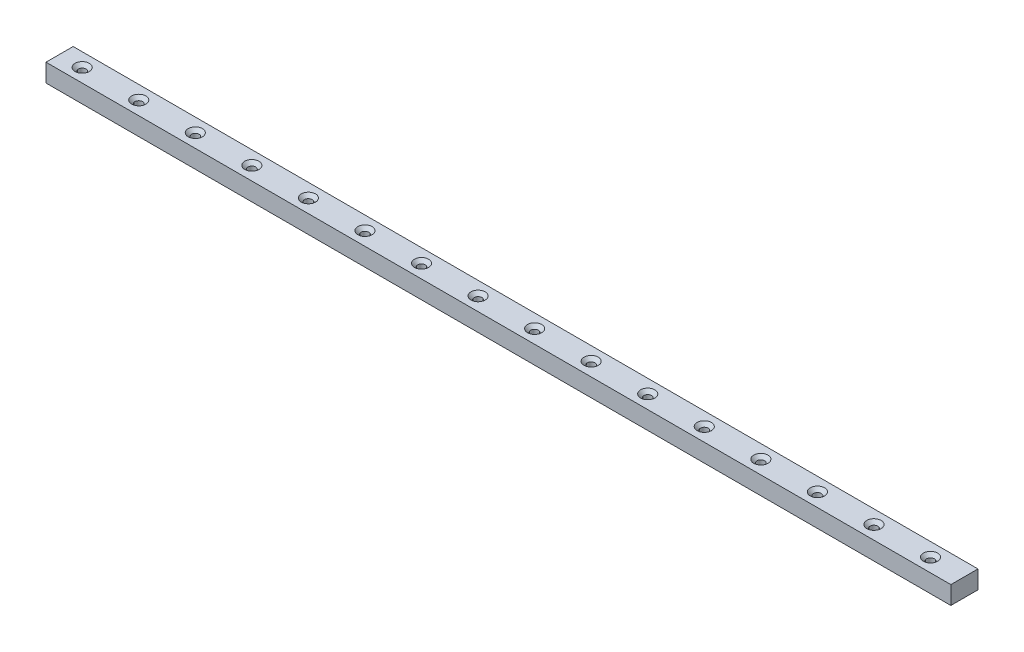
ISO-10303-21;
HEADER;
FILE_DESCRIPTION(('STEP AP214'),'2;1');
FILE_NAME('part.step','',(''),(''),'','','');
FILE_SCHEMA(('AUTOMOTIVE_DESIGN { 1 0 10303 214 1 1 1 1 }'));
ENDSEC;
DATA;
#1=APPLICATION_CONTEXT('core data for automotive mechanical design processes');
#2=APPLICATION_PROTOCOL_DEFINITION('international standard','automotive_design',2000,#1);
#3=PRODUCT_CONTEXT('',#1,'mechanical');
#4=PRODUCT('Part','Part','',(#3));
#5=PRODUCT_RELATED_PRODUCT_CATEGORY('part','',(#4));
#6=PRODUCT_DEFINITION_FORMATION('','',#4);
#7=PRODUCT_DEFINITION_CONTEXT('part definition',#1,'design');
#8=PRODUCT_DEFINITION('design','',#6,#7);
#9=PRODUCT_DEFINITION_SHAPE('','',#8);
#10=(LENGTH_UNIT() NAMED_UNIT(*) SI_UNIT(.MILLI.,.METRE.));
#11=(NAMED_UNIT(*) PLANE_ANGLE_UNIT() SI_UNIT($,.RADIAN.));
#12=(NAMED_UNIT(*) SI_UNIT($,.STERADIAN.) SOLID_ANGLE_UNIT());
#13=UNCERTAINTY_MEASURE_WITH_UNIT(LENGTH_MEASURE(1.E-05),#10,'distance_accuracy_value','');
#14=(GEOMETRIC_REPRESENTATION_CONTEXT(3) GLOBAL_UNCERTAINTY_ASSIGNED_CONTEXT((#13)) GLOBAL_UNIT_ASSIGNED_CONTEXT((#10,
#11,#12)) REPRESENTATION_CONTEXT('',''));
#15=CARTESIAN_POINT('',(0.,0.,0.));
#16=DIRECTION('',(0.,0.,1.));
#17=DIRECTION('',(1.,0.,0.));
#18=AXIS2_PLACEMENT_3D('',#15,#16,#17);
#19=CARTESIAN_POINT('',(385.,4.,0.));
#20=DIRECTION('',(0.,1.,0.));
#21=DIRECTION('',(0.,0.,1.));
#22=AXIS2_PLACEMENT_3D('',#19,#20,#21);
#23=CONICAL_SURFACE('',#22,3.15,0.785398163397448);
#24=CARTESIAN_POINT('',(385.,2.55,0.));
#25=DIRECTION('',(0.,1.,0.));
#26=DIRECTION('',(0.,0.,1.));
#27=AXIS2_PLACEMENT_3D('',#24,#25,#26);
#28=CIRCLE('',#27,1.7);
#29=CARTESIAN_POINT('',(385.,2.55,1.7));
#30=VERTEX_POINT('',#29);
#31=EDGE_CURVE('E11',#30,#30,#28,.T.);
#32=ORIENTED_EDGE('',*,*,#31,.F.);
#33=EDGE_LOOP('',(#32));
#34=FACE_BOUND('',#33,.T.);
#35=CARTESIAN_POINT('',(385.,4.,0.));
#36=DIRECTION('',(0.,1.,0.));
#37=DIRECTION('',(0.,0.,1.));
#38=AXIS2_PLACEMENT_3D('',#35,#36,#37);
#39=CIRCLE('',#38,3.15);
#40=CARTESIAN_POINT('',(385.,4.,3.15));
#41=VERTEX_POINT('',#40);
#42=EDGE_CURVE('E295',#41,#41,#39,.T.);
#43=ORIENTED_EDGE('',*,*,#42,.T.);
#44=EDGE_LOOP('',(#43));
#45=FACE_BOUND('',#44,.T.);
#46=ADVANCED_FACE('F45',(#34,#45),#23,.F.);
#47=CARTESIAN_POINT('',(385.,4.,0.));
#48=DIRECTION('',(0.,1.,0.));
#49=DIRECTION('',(0.,0.,1.));
#50=AXIS2_PLACEMENT_3D('',#47,#48,#49);
#51=CYLINDRICAL_SURFACE('',#50,1.7);
#52=CARTESIAN_POINT('',(385.,-4.,0.));
#53=DIRECTION('',(0.,1.,0.));
#54=DIRECTION('',(0.,0.,1.));
#55=AXIS2_PLACEMENT_3D('',#52,#53,#54);
#56=CIRCLE('',#55,1.7);
#57=CARTESIAN_POINT('',(385.,-4.,1.7));
#58=VERTEX_POINT('',#57);
#59=EDGE_CURVE('E54',#58,#58,#56,.T.);
#60=ORIENTED_EDGE('',*,*,#59,.F.);
#61=EDGE_LOOP('',(#60));
#62=FACE_BOUND('',#61,.T.);
#63=ORIENTED_EDGE('',*,*,#31,.T.);
#64=EDGE_LOOP('',(#63));
#65=FACE_BOUND('',#64,.T.);
#66=ADVANCED_FACE('F304',(#62,#65),#51,.F.);
#67=CARTESIAN_POINT('',(360.,4.,0.));
#68=DIRECTION('',(0.,1.,0.));
#69=DIRECTION('',(0.,0.,1.));
#70=AXIS2_PLACEMENT_3D('',#67,#68,#69);
#71=CONICAL_SURFACE('',#70,3.15,0.785398163397448);
#72=CARTESIAN_POINT('',(360.,2.55,0.));
#73=DIRECTION('',(0.,1.,0.));
#74=DIRECTION('',(0.,0.,1.));
#75=AXIS2_PLACEMENT_3D('',#72,#73,#74);
#76=CIRCLE('',#75,1.7);
#77=CARTESIAN_POINT('',(360.,2.55,1.7));
#78=VERTEX_POINT('',#77);
#79=EDGE_CURVE('E291',#78,#78,#76,.T.);
#80=ORIENTED_EDGE('',*,*,#79,.F.);
#81=EDGE_LOOP('',(#80));
#82=FACE_BOUND('',#81,.T.);
#83=CARTESIAN_POINT('',(360.,4.,0.));
#84=DIRECTION('',(0.,1.,0.));
#85=DIRECTION('',(0.,0.,1.));
#86=AXIS2_PLACEMENT_3D('',#83,#84,#85);
#87=CIRCLE('',#86,3.15);
#88=CARTESIAN_POINT('',(360.,4.,3.15));
#89=VERTEX_POINT('',#88);
#90=EDGE_CURVE('E283',#89,#89,#87,.T.);
#91=ORIENTED_EDGE('',*,*,#90,.T.);
#92=EDGE_LOOP('',(#91));
#93=FACE_BOUND('',#92,.T.);
#94=ADVANCED_FACE('F307',(#82,#93),#71,.F.);
#95=CARTESIAN_POINT('',(360.,4.,0.));
#96=DIRECTION('',(0.,1.,0.));
#97=DIRECTION('',(0.,0.,1.));
#98=AXIS2_PLACEMENT_3D('',#95,#96,#97);
#99=CYLINDRICAL_SURFACE('',#98,1.7);
#100=CARTESIAN_POINT('',(360.,-4.,0.));
#101=DIRECTION('',(0.,1.,0.));
#102=DIRECTION('',(0.,0.,1.));
#103=AXIS2_PLACEMENT_3D('',#100,#101,#102);
#104=CIRCLE('',#103,1.7);
#105=CARTESIAN_POINT('',(360.,-4.,1.7));
#106=VERTEX_POINT('',#105);
#107=EDGE_CURVE('E287',#106,#106,#104,.T.);
#108=ORIENTED_EDGE('',*,*,#107,.F.);
#109=EDGE_LOOP('',(#108));
#110=FACE_BOUND('',#109,.T.);
#111=ORIENTED_EDGE('',*,*,#79,.T.);
#112=EDGE_LOOP('',(#111));
#113=FACE_BOUND('',#112,.T.);
#114=ADVANCED_FACE('F428',(#110,#113),#99,.F.);
#115=CARTESIAN_POINT('',(335.,4.,0.));
#116=DIRECTION('',(0.,1.,0.));
#117=DIRECTION('',(0.,0.,1.));
#118=AXIS2_PLACEMENT_3D('',#115,#116,#117);
#119=CONICAL_SURFACE('',#118,3.15,0.785398163397448);
#120=CARTESIAN_POINT('',(335.,2.55,0.));
#121=DIRECTION('',(0.,1.,0.));
#122=DIRECTION('',(0.,0.,1.));
#123=AXIS2_PLACEMENT_3D('',#120,#121,#122);
#124=CIRCLE('',#123,1.7);
#125=CARTESIAN_POINT('',(335.,2.55,1.7));
#126=VERTEX_POINT('',#125);
#127=EDGE_CURVE('E279',#126,#126,#124,.T.);
#128=ORIENTED_EDGE('',*,*,#127,.F.);
#129=EDGE_LOOP('',(#128));
#130=FACE_BOUND('',#129,.T.);
#131=CARTESIAN_POINT('',(335.,4.,0.));
#132=DIRECTION('',(0.,1.,0.));
#133=DIRECTION('',(0.,0.,1.));
#134=AXIS2_PLACEMENT_3D('',#131,#132,#133);
#135=CIRCLE('',#134,3.15);
#136=CARTESIAN_POINT('',(335.,4.,3.15));
#137=VERTEX_POINT('',#136);
#138=EDGE_CURVE('E271',#137,#137,#135,.T.);
#139=ORIENTED_EDGE('',*,*,#138,.T.);
#140=EDGE_LOOP('',(#139));
#141=FACE_BOUND('',#140,.T.);
#142=ADVANCED_FACE('F424',(#130,#141),#119,.F.);
#143=CARTESIAN_POINT('',(335.,4.,0.));
#144=DIRECTION('',(0.,1.,0.));
#145=DIRECTION('',(0.,0.,1.));
#146=AXIS2_PLACEMENT_3D('',#143,#144,#145);
#147=CYLINDRICAL_SURFACE('',#146,1.7);
#148=CARTESIAN_POINT('',(335.,-4.,0.));
#149=DIRECTION('',(0.,1.,0.));
#150=DIRECTION('',(0.,0.,1.));
#151=AXIS2_PLACEMENT_3D('',#148,#149,#150);
#152=CIRCLE('',#151,1.7);
#153=CARTESIAN_POINT('',(335.,-4.,1.7));
#154=VERTEX_POINT('',#153);
#155=EDGE_CURVE('E275',#154,#154,#152,.T.);
#156=ORIENTED_EDGE('',*,*,#155,.F.);
#157=EDGE_LOOP('',(#156));
#158=FACE_BOUND('',#157,.T.);
#159=ORIENTED_EDGE('',*,*,#127,.T.);
#160=EDGE_LOOP('',(#159));
#161=FACE_BOUND('',#160,.T.);
#162=ADVANCED_FACE('F420',(#158,#161),#147,.F.);
#163=CARTESIAN_POINT('',(310.,4.,0.));
#164=DIRECTION('',(0.,1.,0.));
#165=DIRECTION('',(0.,0.,1.));
#166=AXIS2_PLACEMENT_3D('',#163,#164,#165);
#167=CONICAL_SURFACE('',#166,3.15,0.785398163397448);
#168=CARTESIAN_POINT('',(310.,2.55,0.));
#169=DIRECTION('',(0.,1.,0.));
#170=DIRECTION('',(0.,0.,1.));
#171=AXIS2_PLACEMENT_3D('',#168,#169,#170);
#172=CIRCLE('',#171,1.7);
#173=CARTESIAN_POINT('',(310.,2.55,1.7));
#174=VERTEX_POINT('',#173);
#175=EDGE_CURVE('E267',#174,#174,#172,.T.);
#176=ORIENTED_EDGE('',*,*,#175,.F.);
#177=EDGE_LOOP('',(#176));
#178=FACE_BOUND('',#177,.T.);
#179=CARTESIAN_POINT('',(310.,4.,0.));
#180=DIRECTION('',(0.,1.,0.));
#181=DIRECTION('',(0.,0.,1.));
#182=AXIS2_PLACEMENT_3D('',#179,#180,#181);
#183=CIRCLE('',#182,3.15);
#184=CARTESIAN_POINT('',(310.,4.,3.15));
#185=VERTEX_POINT('',#184);
#186=EDGE_CURVE('E259',#185,#185,#183,.T.);
#187=ORIENTED_EDGE('',*,*,#186,.T.);
#188=EDGE_LOOP('',(#187));
#189=FACE_BOUND('',#188,.T.);
#190=ADVANCED_FACE('F416',(#178,#189),#167,.F.);
#191=CARTESIAN_POINT('',(310.,4.,0.));
#192=DIRECTION('',(0.,1.,0.));
#193=DIRECTION('',(0.,0.,1.));
#194=AXIS2_PLACEMENT_3D('',#191,#192,#193);
#195=CYLINDRICAL_SURFACE('',#194,1.7);
#196=CARTESIAN_POINT('',(310.,-4.,0.));
#197=DIRECTION('',(0.,1.,0.));
#198=DIRECTION('',(0.,0.,1.));
#199=AXIS2_PLACEMENT_3D('',#196,#197,#198);
#200=CIRCLE('',#199,1.7);
#201=CARTESIAN_POINT('',(310.,-4.,1.7));
#202=VERTEX_POINT('',#201);
#203=EDGE_CURVE('E263',#202,#202,#200,.T.);
#204=ORIENTED_EDGE('',*,*,#203,.F.);
#205=EDGE_LOOP('',(#204));
#206=FACE_BOUND('',#205,.T.);
#207=ORIENTED_EDGE('',*,*,#175,.T.);
#208=EDGE_LOOP('',(#207));
#209=FACE_BOUND('',#208,.T.);
#210=ADVANCED_FACE('F412',(#206,#209),#195,.F.);
#211=CARTESIAN_POINT('',(285.,4.,0.));
#212=DIRECTION('',(0.,1.,0.));
#213=DIRECTION('',(0.,0.,1.));
#214=AXIS2_PLACEMENT_3D('',#211,#212,#213);
#215=CONICAL_SURFACE('',#214,3.15,0.785398163397448);
#216=CARTESIAN_POINT('',(285.,2.55,0.));
#217=DIRECTION('',(0.,1.,0.));
#218=DIRECTION('',(0.,0.,1.));
#219=AXIS2_PLACEMENT_3D('',#216,#217,#218);
#220=CIRCLE('',#219,1.7);
#221=CARTESIAN_POINT('',(285.,2.55,1.7));
#222=VERTEX_POINT('',#221);
#223=EDGE_CURVE('E255',#222,#222,#220,.T.);
#224=ORIENTED_EDGE('',*,*,#223,.F.);
#225=EDGE_LOOP('',(#224));
#226=FACE_BOUND('',#225,.T.);
#227=CARTESIAN_POINT('',(285.,4.,0.));
#228=DIRECTION('',(0.,1.,0.));
#229=DIRECTION('',(0.,0.,1.));
#230=AXIS2_PLACEMENT_3D('',#227,#228,#229);
#231=CIRCLE('',#230,3.15);
#232=CARTESIAN_POINT('',(285.,4.,3.15));
#233=VERTEX_POINT('',#232);
#234=EDGE_CURVE('E247',#233,#233,#231,.T.);
#235=ORIENTED_EDGE('',*,*,#234,.T.);
#236=EDGE_LOOP('',(#235));
#237=FACE_BOUND('',#236,.T.);
#238=ADVANCED_FACE('F408',(#226,#237),#215,.F.);
#239=CARTESIAN_POINT('',(285.,4.,0.));
#240=DIRECTION('',(0.,1.,0.));
#241=DIRECTION('',(0.,0.,1.));
#242=AXIS2_PLACEMENT_3D('',#239,#240,#241);
#243=CYLINDRICAL_SURFACE('',#242,1.7);
#244=CARTESIAN_POINT('',(285.,-4.,0.));
#245=DIRECTION('',(0.,1.,0.));
#246=DIRECTION('',(0.,0.,1.));
#247=AXIS2_PLACEMENT_3D('',#244,#245,#246);
#248=CIRCLE('',#247,1.7);
#249=CARTESIAN_POINT('',(285.,-4.,1.7));
#250=VERTEX_POINT('',#249);
#251=EDGE_CURVE('E251',#250,#250,#248,.T.);
#252=ORIENTED_EDGE('',*,*,#251,.F.);
#253=EDGE_LOOP('',(#252));
#254=FACE_BOUND('',#253,.T.);
#255=ORIENTED_EDGE('',*,*,#223,.T.);
#256=EDGE_LOOP('',(#255));
#257=FACE_BOUND('',#256,.T.);
#258=ADVANCED_FACE('F404',(#254,#257),#243,.F.);
#259=CARTESIAN_POINT('',(260.,4.,0.));
#260=DIRECTION('',(0.,1.,0.));
#261=DIRECTION('',(0.,0.,1.));
#262=AXIS2_PLACEMENT_3D('',#259,#260,#261);
#263=CONICAL_SURFACE('',#262,3.15,0.785398163397448);
#264=CARTESIAN_POINT('',(260.,2.55,0.));
#265=DIRECTION('',(0.,1.,0.));
#266=DIRECTION('',(0.,0.,1.));
#267=AXIS2_PLACEMENT_3D('',#264,#265,#266);
#268=CIRCLE('',#267,1.7);
#269=CARTESIAN_POINT('',(260.,2.55,1.7));
#270=VERTEX_POINT('',#269);
#271=EDGE_CURVE('E243',#270,#270,#268,.T.);
#272=ORIENTED_EDGE('',*,*,#271,.F.);
#273=EDGE_LOOP('',(#272));
#274=FACE_BOUND('',#273,.T.);
#275=CARTESIAN_POINT('',(260.,4.,0.));
#276=DIRECTION('',(0.,1.,0.));
#277=DIRECTION('',(0.,0.,1.));
#278=AXIS2_PLACEMENT_3D('',#275,#276,#277);
#279=CIRCLE('',#278,3.15);
#280=CARTESIAN_POINT('',(260.,4.,3.15));
#281=VERTEX_POINT('',#280);
#282=EDGE_CURVE('E235',#281,#281,#279,.T.);
#283=ORIENTED_EDGE('',*,*,#282,.T.);
#284=EDGE_LOOP('',(#283));
#285=FACE_BOUND('',#284,.T.);
#286=ADVANCED_FACE('F400',(#274,#285),#263,.F.);
#287=CARTESIAN_POINT('',(260.,4.,0.));
#288=DIRECTION('',(0.,1.,0.));
#289=DIRECTION('',(0.,0.,1.));
#290=AXIS2_PLACEMENT_3D('',#287,#288,#289);
#291=CYLINDRICAL_SURFACE('',#290,1.7);
#292=CARTESIAN_POINT('',(260.,-4.,0.));
#293=DIRECTION('',(0.,1.,0.));
#294=DIRECTION('',(0.,0.,1.));
#295=AXIS2_PLACEMENT_3D('',#292,#293,#294);
#296=CIRCLE('',#295,1.7);
#297=CARTESIAN_POINT('',(260.,-4.,1.7));
#298=VERTEX_POINT('',#297);
#299=EDGE_CURVE('E239',#298,#298,#296,.T.);
#300=ORIENTED_EDGE('',*,*,#299,.F.);
#301=EDGE_LOOP('',(#300));
#302=FACE_BOUND('',#301,.T.);
#303=ORIENTED_EDGE('',*,*,#271,.T.);
#304=EDGE_LOOP('',(#303));
#305=FACE_BOUND('',#304,.T.);
#306=ADVANCED_FACE('F396',(#302,#305),#291,.F.);
#307=CARTESIAN_POINT('',(235.,4.,0.));
#308=DIRECTION('',(0.,1.,0.));
#309=DIRECTION('',(0.,0.,1.));
#310=AXIS2_PLACEMENT_3D('',#307,#308,#309);
#311=CONICAL_SURFACE('',#310,3.15,0.785398163397448);
#312=CARTESIAN_POINT('',(235.,2.55,0.));
#313=DIRECTION('',(0.,1.,0.));
#314=DIRECTION('',(0.,0.,1.));
#315=AXIS2_PLACEMENT_3D('',#312,#313,#314);
#316=CIRCLE('',#315,1.7);
#317=CARTESIAN_POINT('',(235.,2.55,1.7));
#318=VERTEX_POINT('',#317);
#319=EDGE_CURVE('E231',#318,#318,#316,.T.);
#320=ORIENTED_EDGE('',*,*,#319,.F.);
#321=EDGE_LOOP('',(#320));
#322=FACE_BOUND('',#321,.T.);
#323=CARTESIAN_POINT('',(235.,4.,0.));
#324=DIRECTION('',(0.,1.,0.));
#325=DIRECTION('',(0.,0.,1.));
#326=AXIS2_PLACEMENT_3D('',#323,#324,#325);
#327=CIRCLE('',#326,3.15);
#328=CARTESIAN_POINT('',(235.,4.,3.15));
#329=VERTEX_POINT('',#328);
#330=EDGE_CURVE('E223',#329,#329,#327,.T.);
#331=ORIENTED_EDGE('',*,*,#330,.T.);
#332=EDGE_LOOP('',(#331));
#333=FACE_BOUND('',#332,.T.);
#334=ADVANCED_FACE('F392',(#322,#333),#311,.F.);
#335=CARTESIAN_POINT('',(235.,4.,0.));
#336=DIRECTION('',(0.,1.,0.));
#337=DIRECTION('',(0.,0.,1.));
#338=AXIS2_PLACEMENT_3D('',#335,#336,#337);
#339=CYLINDRICAL_SURFACE('',#338,1.7);
#340=CARTESIAN_POINT('',(235.,-4.,0.));
#341=DIRECTION('',(0.,1.,0.));
#342=DIRECTION('',(0.,0.,1.));
#343=AXIS2_PLACEMENT_3D('',#340,#341,#342);
#344=CIRCLE('',#343,1.7);
#345=CARTESIAN_POINT('',(235.,-4.,1.7));
#346=VERTEX_POINT('',#345);
#347=EDGE_CURVE('E227',#346,#346,#344,.T.);
#348=ORIENTED_EDGE('',*,*,#347,.F.);
#349=EDGE_LOOP('',(#348));
#350=FACE_BOUND('',#349,.T.);
#351=ORIENTED_EDGE('',*,*,#319,.T.);
#352=EDGE_LOOP('',(#351));
#353=FACE_BOUND('',#352,.T.);
#354=ADVANCED_FACE('F388',(#350,#353),#339,.F.);
#355=CARTESIAN_POINT('',(210.,4.,0.));
#356=DIRECTION('',(0.,1.,0.));
#357=DIRECTION('',(0.,0.,1.));
#358=AXIS2_PLACEMENT_3D('',#355,#356,#357);
#359=CONICAL_SURFACE('',#358,3.15,0.785398163397448);
#360=CARTESIAN_POINT('',(210.,2.55,0.));
#361=DIRECTION('',(0.,1.,0.));
#362=DIRECTION('',(0.,0.,1.));
#363=AXIS2_PLACEMENT_3D('',#360,#361,#362);
#364=CIRCLE('',#363,1.7);
#365=CARTESIAN_POINT('',(210.,2.55,1.7));
#366=VERTEX_POINT('',#365);
#367=EDGE_CURVE('E219',#366,#366,#364,.T.);
#368=ORIENTED_EDGE('',*,*,#367,.F.);
#369=EDGE_LOOP('',(#368));
#370=FACE_BOUND('',#369,.T.);
#371=CARTESIAN_POINT('',(210.,4.,0.));
#372=DIRECTION('',(0.,1.,0.));
#373=DIRECTION('',(0.,0.,1.));
#374=AXIS2_PLACEMENT_3D('',#371,#372,#373);
#375=CIRCLE('',#374,3.15);
#376=CARTESIAN_POINT('',(210.,4.,3.15));
#377=VERTEX_POINT('',#376);
#378=EDGE_CURVE('E211',#377,#377,#375,.T.);
#379=ORIENTED_EDGE('',*,*,#378,.T.);
#380=EDGE_LOOP('',(#379));
#381=FACE_BOUND('',#380,.T.);
#382=ADVANCED_FACE('F384',(#370,#381),#359,.F.);
#383=CARTESIAN_POINT('',(210.,4.,0.));
#384=DIRECTION('',(0.,1.,0.));
#385=DIRECTION('',(0.,0.,1.));
#386=AXIS2_PLACEMENT_3D('',#383,#384,#385);
#387=CYLINDRICAL_SURFACE('',#386,1.7);
#388=CARTESIAN_POINT('',(210.,-4.,0.));
#389=DIRECTION('',(0.,1.,0.));
#390=DIRECTION('',(0.,0.,1.));
#391=AXIS2_PLACEMENT_3D('',#388,#389,#390);
#392=CIRCLE('',#391,1.7);
#393=CARTESIAN_POINT('',(210.,-4.,1.7));
#394=VERTEX_POINT('',#393);
#395=EDGE_CURVE('E215',#394,#394,#392,.T.);
#396=ORIENTED_EDGE('',*,*,#395,.F.);
#397=EDGE_LOOP('',(#396));
#398=FACE_BOUND('',#397,.T.);
#399=ORIENTED_EDGE('',*,*,#367,.T.);
#400=EDGE_LOOP('',(#399));
#401=FACE_BOUND('',#400,.T.);
#402=ADVANCED_FACE('F380',(#398,#401),#387,.F.);
#403=CARTESIAN_POINT('',(185.,4.,0.));
#404=DIRECTION('',(0.,1.,0.));
#405=DIRECTION('',(0.,0.,1.));
#406=AXIS2_PLACEMENT_3D('',#403,#404,#405);
#407=CONICAL_SURFACE('',#406,3.15,0.785398163397448);
#408=CARTESIAN_POINT('',(185.,2.55,0.));
#409=DIRECTION('',(0.,1.,0.));
#410=DIRECTION('',(0.,0.,1.));
#411=AXIS2_PLACEMENT_3D('',#408,#409,#410);
#412=CIRCLE('',#411,1.7);
#413=CARTESIAN_POINT('',(185.,2.55,1.7));
#414=VERTEX_POINT('',#413);
#415=EDGE_CURVE('E207',#414,#414,#412,.T.);
#416=ORIENTED_EDGE('',*,*,#415,.F.);
#417=EDGE_LOOP('',(#416));
#418=FACE_BOUND('',#417,.T.);
#419=CARTESIAN_POINT('',(185.,4.,0.));
#420=DIRECTION('',(0.,1.,0.));
#421=DIRECTION('',(0.,0.,1.));
#422=AXIS2_PLACEMENT_3D('',#419,#420,#421);
#423=CIRCLE('',#422,3.15);
#424=CARTESIAN_POINT('',(185.,4.,3.15));
#425=VERTEX_POINT('',#424);
#426=EDGE_CURVE('E199',#425,#425,#423,.T.);
#427=ORIENTED_EDGE('',*,*,#426,.T.);
#428=EDGE_LOOP('',(#427));
#429=FACE_BOUND('',#428,.T.);
#430=ADVANCED_FACE('F376',(#418,#429),#407,.F.);
#431=CARTESIAN_POINT('',(185.,4.,0.));
#432=DIRECTION('',(0.,1.,0.));
#433=DIRECTION('',(0.,0.,1.));
#434=AXIS2_PLACEMENT_3D('',#431,#432,#433);
#435=CYLINDRICAL_SURFACE('',#434,1.7);
#436=CARTESIAN_POINT('',(185.,-4.,0.));
#437=DIRECTION('',(0.,1.,0.));
#438=DIRECTION('',(0.,0.,1.));
#439=AXIS2_PLACEMENT_3D('',#436,#437,#438);
#440=CIRCLE('',#439,1.7);
#441=CARTESIAN_POINT('',(185.,-4.,1.7));
#442=VERTEX_POINT('',#441);
#443=EDGE_CURVE('E203',#442,#442,#440,.T.);
#444=ORIENTED_EDGE('',*,*,#443,.F.);
#445=EDGE_LOOP('',(#444));
#446=FACE_BOUND('',#445,.T.);
#447=ORIENTED_EDGE('',*,*,#415,.T.);
#448=EDGE_LOOP('',(#447));
#449=FACE_BOUND('',#448,.T.);
#450=ADVANCED_FACE('F372',(#446,#449),#435,.F.);
#451=CARTESIAN_POINT('',(160.,4.,0.));
#452=DIRECTION('',(0.,1.,0.));
#453=DIRECTION('',(0.,0.,1.));
#454=AXIS2_PLACEMENT_3D('',#451,#452,#453);
#455=CONICAL_SURFACE('',#454,3.15,0.785398163397448);
#456=CARTESIAN_POINT('',(160.,2.55,0.));
#457=DIRECTION('',(0.,1.,0.));
#458=DIRECTION('',(0.,0.,1.));
#459=AXIS2_PLACEMENT_3D('',#456,#457,#458);
#460=CIRCLE('',#459,1.7);
#461=CARTESIAN_POINT('',(160.,2.55,1.7));
#462=VERTEX_POINT('',#461);
#463=EDGE_CURVE('E195',#462,#462,#460,.T.);
#464=ORIENTED_EDGE('',*,*,#463,.F.);
#465=EDGE_LOOP('',(#464));
#466=FACE_BOUND('',#465,.T.);
#467=CARTESIAN_POINT('',(160.,4.,0.));
#468=DIRECTION('',(0.,1.,0.));
#469=DIRECTION('',(0.,0.,1.));
#470=AXIS2_PLACEMENT_3D('',#467,#468,#469);
#471=CIRCLE('',#470,3.15);
#472=CARTESIAN_POINT('',(160.,4.,3.15));
#473=VERTEX_POINT('',#472);
#474=EDGE_CURVE('E187',#473,#473,#471,.T.);
#475=ORIENTED_EDGE('',*,*,#474,.T.);
#476=EDGE_LOOP('',(#475));
#477=FACE_BOUND('',#476,.T.);
#478=ADVANCED_FACE('F368',(#466,#477),#455,.F.);
#479=CARTESIAN_POINT('',(160.,4.,0.));
#480=DIRECTION('',(0.,1.,0.));
#481=DIRECTION('',(0.,0.,1.));
#482=AXIS2_PLACEMENT_3D('',#479,#480,#481);
#483=CYLINDRICAL_SURFACE('',#482,1.7);
#484=CARTESIAN_POINT('',(160.,-4.,0.));
#485=DIRECTION('',(0.,1.,0.));
#486=DIRECTION('',(0.,0.,1.));
#487=AXIS2_PLACEMENT_3D('',#484,#485,#486);
#488=CIRCLE('',#487,1.7);
#489=CARTESIAN_POINT('',(160.,-4.,1.7));
#490=VERTEX_POINT('',#489);
#491=EDGE_CURVE('E191',#490,#490,#488,.T.);
#492=ORIENTED_EDGE('',*,*,#491,.F.);
#493=EDGE_LOOP('',(#492));
#494=FACE_BOUND('',#493,.T.);
#495=ORIENTED_EDGE('',*,*,#463,.T.);
#496=EDGE_LOOP('',(#495));
#497=FACE_BOUND('',#496,.T.);
#498=ADVANCED_FACE('F364',(#494,#497),#483,.F.);
#499=CARTESIAN_POINT('',(135.,4.,0.));
#500=DIRECTION('',(0.,1.,0.));
#501=DIRECTION('',(0.,0.,1.));
#502=AXIS2_PLACEMENT_3D('',#499,#500,#501);
#503=CONICAL_SURFACE('',#502,3.15,0.785398163397448);
#504=CARTESIAN_POINT('',(135.,2.55,0.));
#505=DIRECTION('',(0.,1.,0.));
#506=DIRECTION('',(0.,0.,1.));
#507=AXIS2_PLACEMENT_3D('',#504,#505,#506);
#508=CIRCLE('',#507,1.7);
#509=CARTESIAN_POINT('',(135.,2.55,1.7));
#510=VERTEX_POINT('',#509);
#511=EDGE_CURVE('E183',#510,#510,#508,.T.);
#512=ORIENTED_EDGE('',*,*,#511,.F.);
#513=EDGE_LOOP('',(#512));
#514=FACE_BOUND('',#513,.T.);
#515=CARTESIAN_POINT('',(135.,4.,0.));
#516=DIRECTION('',(0.,1.,0.));
#517=DIRECTION('',(0.,0.,1.));
#518=AXIS2_PLACEMENT_3D('',#515,#516,#517);
#519=CIRCLE('',#518,3.15);
#520=CARTESIAN_POINT('',(135.,4.,3.15));
#521=VERTEX_POINT('',#520);
#522=EDGE_CURVE('E175',#521,#521,#519,.T.);
#523=ORIENTED_EDGE('',*,*,#522,.T.);
#524=EDGE_LOOP('',(#523));
#525=FACE_BOUND('',#524,.T.);
#526=ADVANCED_FACE('F360',(#514,#525),#503,.F.);
#527=CARTESIAN_POINT('',(135.,4.,0.));
#528=DIRECTION('',(0.,1.,0.));
#529=DIRECTION('',(0.,0.,1.));
#530=AXIS2_PLACEMENT_3D('',#527,#528,#529);
#531=CYLINDRICAL_SURFACE('',#530,1.7);
#532=CARTESIAN_POINT('',(135.,-4.,0.));
#533=DIRECTION('',(0.,1.,0.));
#534=DIRECTION('',(0.,0.,1.));
#535=AXIS2_PLACEMENT_3D('',#532,#533,#534);
#536=CIRCLE('',#535,1.7);
#537=CARTESIAN_POINT('',(135.,-4.,1.7));
#538=VERTEX_POINT('',#537);
#539=EDGE_CURVE('E179',#538,#538,#536,.T.);
#540=ORIENTED_EDGE('',*,*,#539,.F.);
#541=EDGE_LOOP('',(#540));
#542=FACE_BOUND('',#541,.T.);
#543=ORIENTED_EDGE('',*,*,#511,.T.);
#544=EDGE_LOOP('',(#543));
#545=FACE_BOUND('',#544,.T.);
#546=ADVANCED_FACE('F356',(#542,#545),#531,.F.);
#547=CARTESIAN_POINT('',(110.,4.,0.));
#548=DIRECTION('',(0.,1.,0.));
#549=DIRECTION('',(0.,0.,1.));
#550=AXIS2_PLACEMENT_3D('',#547,#548,#549);
#551=CONICAL_SURFACE('',#550,3.15,0.785398163397448);
#552=CARTESIAN_POINT('',(110.,2.55,0.));
#553=DIRECTION('',(0.,1.,0.));
#554=DIRECTION('',(0.,0.,1.));
#555=AXIS2_PLACEMENT_3D('',#552,#553,#554);
#556=CIRCLE('',#555,1.7);
#557=CARTESIAN_POINT('',(110.,2.55,1.7));
#558=VERTEX_POINT('',#557);
#559=EDGE_CURVE('E171',#558,#558,#556,.T.);
#560=ORIENTED_EDGE('',*,*,#559,.F.);
#561=EDGE_LOOP('',(#560));
#562=FACE_BOUND('',#561,.T.);
#563=CARTESIAN_POINT('',(110.,4.,0.));
#564=DIRECTION('',(0.,1.,0.));
#565=DIRECTION('',(0.,0.,1.));
#566=AXIS2_PLACEMENT_3D('',#563,#564,#565);
#567=CIRCLE('',#566,3.15);
#568=CARTESIAN_POINT('',(110.,4.,3.15));
#569=VERTEX_POINT('',#568);
#570=EDGE_CURVE('E163',#569,#569,#567,.T.);
#571=ORIENTED_EDGE('',*,*,#570,.T.);
#572=EDGE_LOOP('',(#571));
#573=FACE_BOUND('',#572,.T.);
#574=ADVANCED_FACE('F352',(#562,#573),#551,.F.);
#575=CARTESIAN_POINT('',(110.,4.,0.));
#576=DIRECTION('',(0.,1.,0.));
#577=DIRECTION('',(0.,0.,1.));
#578=AXIS2_PLACEMENT_3D('',#575,#576,#577);
#579=CYLINDRICAL_SURFACE('',#578,1.7);
#580=CARTESIAN_POINT('',(110.,-4.,0.));
#581=DIRECTION('',(0.,1.,0.));
#582=DIRECTION('',(0.,0.,1.));
#583=AXIS2_PLACEMENT_3D('',#580,#581,#582);
#584=CIRCLE('',#583,1.7);
#585=CARTESIAN_POINT('',(110.,-4.,1.7));
#586=VERTEX_POINT('',#585);
#587=EDGE_CURVE('E167',#586,#586,#584,.T.);
#588=ORIENTED_EDGE('',*,*,#587,.F.);
#589=EDGE_LOOP('',(#588));
#590=FACE_BOUND('',#589,.T.);
#591=ORIENTED_EDGE('',*,*,#559,.T.);
#592=EDGE_LOOP('',(#591));
#593=FACE_BOUND('',#592,.T.);
#594=ADVANCED_FACE('F348',(#590,#593),#579,.F.);
#595=CARTESIAN_POINT('',(85.,4.,0.));
#596=DIRECTION('',(0.,1.,0.));
#597=DIRECTION('',(0.,0.,1.));
#598=AXIS2_PLACEMENT_3D('',#595,#596,#597);
#599=CONICAL_SURFACE('',#598,3.15,0.785398163397448);
#600=CARTESIAN_POINT('',(85.,2.55,0.));
#601=DIRECTION('',(0.,1.,0.));
#602=DIRECTION('',(0.,0.,1.));
#603=AXIS2_PLACEMENT_3D('',#600,#601,#602);
#604=CIRCLE('',#603,1.7);
#605=CARTESIAN_POINT('',(85.,2.55,1.7));
#606=VERTEX_POINT('',#605);
#607=EDGE_CURVE('E159',#606,#606,#604,.T.);
#608=ORIENTED_EDGE('',*,*,#607,.F.);
#609=EDGE_LOOP('',(#608));
#610=FACE_BOUND('',#609,.T.);
#611=CARTESIAN_POINT('',(85.,4.,0.));
#612=DIRECTION('',(0.,1.,0.));
#613=DIRECTION('',(0.,0.,1.));
#614=AXIS2_PLACEMENT_3D('',#611,#612,#613);
#615=CIRCLE('',#614,3.15);
#616=CARTESIAN_POINT('',(85.,4.,3.15));
#617=VERTEX_POINT('',#616);
#618=EDGE_CURVE('E151',#617,#617,#615,.T.);
#619=ORIENTED_EDGE('',*,*,#618,.T.);
#620=EDGE_LOOP('',(#619));
#621=FACE_BOUND('',#620,.T.);
#622=ADVANCED_FACE('F344',(#610,#621),#599,.F.);
#623=CARTESIAN_POINT('',(85.,4.,0.));
#624=DIRECTION('',(0.,1.,0.));
#625=DIRECTION('',(0.,0.,1.));
#626=AXIS2_PLACEMENT_3D('',#623,#624,#625);
#627=CYLINDRICAL_SURFACE('',#626,1.7);
#628=CARTESIAN_POINT('',(85.,-4.,0.));
#629=DIRECTION('',(0.,1.,0.));
#630=DIRECTION('',(0.,0.,1.));
#631=AXIS2_PLACEMENT_3D('',#628,#629,#630);
#632=CIRCLE('',#631,1.7);
#633=CARTESIAN_POINT('',(85.,-4.,1.7));
#634=VERTEX_POINT('',#633);
#635=EDGE_CURVE('E155',#634,#634,#632,.T.);
#636=ORIENTED_EDGE('',*,*,#635,.F.);
#637=EDGE_LOOP('',(#636));
#638=FACE_BOUND('',#637,.T.);
#639=ORIENTED_EDGE('',*,*,#607,.T.);
#640=EDGE_LOOP('',(#639));
#641=FACE_BOUND('',#640,.T.);
#642=ADVANCED_FACE('F340',(#638,#641),#627,.F.);
#643=CARTESIAN_POINT('',(60.,4.,0.));
#644=DIRECTION('',(0.,1.,0.));
#645=DIRECTION('',(0.,0.,1.));
#646=AXIS2_PLACEMENT_3D('',#643,#644,#645);
#647=CONICAL_SURFACE('',#646,3.15,0.785398163397448);
#648=CARTESIAN_POINT('',(60.,2.55,0.));
#649=DIRECTION('',(0.,1.,0.));
#650=DIRECTION('',(0.,0.,1.));
#651=AXIS2_PLACEMENT_3D('',#648,#649,#650);
#652=CIRCLE('',#651,1.7);
#653=CARTESIAN_POINT('',(60.,2.55,1.7));
#654=VERTEX_POINT('',#653);
#655=EDGE_CURVE('E147',#654,#654,#652,.T.);
#656=ORIENTED_EDGE('',*,*,#655,.F.);
#657=EDGE_LOOP('',(#656));
#658=FACE_BOUND('',#657,.T.);
#659=CARTESIAN_POINT('',(60.,4.,0.));
#660=DIRECTION('',(0.,1.,0.));
#661=DIRECTION('',(0.,0.,1.));
#662=AXIS2_PLACEMENT_3D('',#659,#660,#661);
#663=CIRCLE('',#662,3.15);
#664=CARTESIAN_POINT('',(60.,4.,3.15));
#665=VERTEX_POINT('',#664);
#666=EDGE_CURVE('E135',#665,#665,#663,.T.);
#667=ORIENTED_EDGE('',*,*,#666,.T.);
#668=EDGE_LOOP('',(#667));
#669=FACE_BOUND('',#668,.T.);
#670=ADVANCED_FACE('F336',(#658,#669),#647,.F.);
#671=CARTESIAN_POINT('',(60.,4.,0.));
#672=DIRECTION('',(0.,1.,0.));
#673=DIRECTION('',(0.,0.,1.));
#674=AXIS2_PLACEMENT_3D('',#671,#672,#673);
#675=CYLINDRICAL_SURFACE('',#674,1.7);
#676=CARTESIAN_POINT('',(60.,-4.,0.));
#677=DIRECTION('',(0.,1.,0.));
#678=DIRECTION('',(0.,0.,1.));
#679=AXIS2_PLACEMENT_3D('',#676,#677,#678);
#680=CIRCLE('',#679,1.7);
#681=CARTESIAN_POINT('',(60.,-4.,1.7));
#682=VERTEX_POINT('',#681);
#683=EDGE_CURVE('E143',#682,#682,#680,.T.);
#684=ORIENTED_EDGE('',*,*,#683,.F.);
#685=EDGE_LOOP('',(#684));
#686=FACE_BOUND('',#685,.T.);
#687=ORIENTED_EDGE('',*,*,#655,.T.);
#688=EDGE_LOOP('',(#687));
#689=FACE_BOUND('',#688,.T.);
#690=ADVANCED_FACE('F333',(#686,#689),#675,.F.);
#691=CARTESIAN_POINT('',(400.,-4.,6.));
#692=DIRECTION('',(0.,0.,1.));
#693=DIRECTION('',(1.,0.,0.));
#694=AXIS2_PLACEMENT_3D('',#691,#692,#693);
#695=PLANE('',#694);
#696=DIRECTION('',(0.,1.,0.));
#697=VECTOR('',#696,1.);
#698=CARTESIAN_POINT('',(0.,-4.,6.));
#699=LINE('',#698,#697);
#700=CARTESIAN_POINT('',(0.,-4.,6.));
#701=VERTEX_POINT('',#700);
#702=CARTESIAN_POINT('',(0.,4.,6.));
#703=VERTEX_POINT('',#702);
#704=EDGE_CURVE('E121',#701,#703,#699,.T.);
#705=ORIENTED_EDGE('',*,*,#704,.F.);
#706=DIRECTION('',(-1.,0.,0.));
#707=VECTOR('',#706,1.);
#708=CARTESIAN_POINT('',(400.,-4.,6.));
#709=LINE('',#708,#707);
#710=CARTESIAN_POINT('',(400.,-4.,6.));
#711=VERTEX_POINT('',#710);
#712=EDGE_CURVE('E62',#711,#701,#709,.T.);
#713=ORIENTED_EDGE('',*,*,#712,.F.);
#714=DIRECTION('',(0.,1.,0.));
#715=VECTOR('',#714,1.);
#716=CARTESIAN_POINT('',(400.,-4.,6.));
#717=LINE('',#716,#715);
#718=CARTESIAN_POINT('',(400.,4.,6.));
#719=VERTEX_POINT('',#718);
#720=EDGE_CURVE('E113',#711,#719,#717,.T.);
#721=ORIENTED_EDGE('',*,*,#720,.T.);
#722=DIRECTION('',(-1.,0.,0.));
#723=VECTOR('',#722,1.);
#724=CARTESIAN_POINT('',(400.,4.,6.));
#725=LINE('',#724,#723);
#726=EDGE_CURVE('E87',#719,#703,#725,.T.);
#727=ORIENTED_EDGE('',*,*,#726,.T.);
#728=EDGE_LOOP('',(#705,#713,#721,#727));
#729=FACE_BOUND('',#728,.T.);
#730=ADVANCED_FACE('F330',(#729),#695,.T.);
#731=CARTESIAN_POINT('',(400.,-4.,6.));
#732=DIRECTION('',(0.,1.,0.));
#733=DIRECTION('',(0.,0.,1.));
#734=AXIS2_PLACEMENT_3D('',#731,#732,#733);
#735=PLANE('',#734);
#736=CARTESIAN_POINT('',(35.,-4.,0.));
#737=DIRECTION('',(0.,1.,0.));
#738=DIRECTION('',(0.,0.,1.));
#739=AXIS2_PLACEMENT_3D('',#736,#737,#738);
#740=CIRCLE('',#739,1.7);
#741=CARTESIAN_POINT('',(35.,-4.,1.7));
#742=VERTEX_POINT('',#741);
#743=EDGE_CURVE('E686',#742,#742,#740,.T.);
#744=ORIENTED_EDGE('',*,*,#743,.T.);
#745=EDGE_LOOP('',(#744));
#746=FACE_BOUND('',#745,.T.);
#747=CARTESIAN_POINT('',(10.,-4.,0.));
#748=DIRECTION('',(0.,1.,0.));
#749=DIRECTION('',(0.,0.,1.));
#750=AXIS2_PLACEMENT_3D('',#747,#748,#749);
#751=CIRCLE('',#750,1.7);
#752=CARTESIAN_POINT('',(10.,-4.,1.7));
#753=VERTEX_POINT('',#752);
#754=EDGE_CURVE('E126',#753,#753,#751,.T.);
#755=ORIENTED_EDGE('',*,*,#754,.T.);
#756=EDGE_LOOP('',(#755));
#757=FACE_BOUND('',#756,.T.);
#758=DIRECTION('',(0.,0.,-1.));
#759=VECTOR('',#758,1.);
#760=CARTESIAN_POINT('',(0.,-4.,6.));
#761=LINE('',#760,#759);
#762=CARTESIAN_POINT('',(0.,-4.,-6.));
#763=VERTEX_POINT('',#762);
#764=EDGE_CURVE('E79',#701,#763,#761,.T.);
#765=ORIENTED_EDGE('',*,*,#764,.T.);
#766=DIRECTION('',(-1.,0.,0.));
#767=VECTOR('',#766,1.);
#768=CARTESIAN_POINT('',(400.,-4.,-6.));
#769=LINE('',#768,#767);
#770=CARTESIAN_POINT('',(400.,-4.,-6.));
#771=VERTEX_POINT('',#770);
#772=EDGE_CURVE('E108',#771,#763,#769,.T.);
#773=ORIENTED_EDGE('',*,*,#772,.F.);
#774=DIRECTION('',(0.,0.,-1.));
#775=VECTOR('',#774,1.);
#776=CARTESIAN_POINT('',(400.,-4.,6.));
#777=LINE('',#776,#775);
#778=EDGE_CURVE('E97',#711,#771,#777,.T.);
#779=ORIENTED_EDGE('',*,*,#778,.F.);
#780=ORIENTED_EDGE('',*,*,#712,.T.);
#781=EDGE_LOOP('',(#765,#773,#779,#780));
#782=FACE_BOUND('',#781,.T.);
#783=ORIENTED_EDGE('',*,*,#683,.T.);
#784=EDGE_LOOP('',(#783));
#785=FACE_BOUND('',#784,.T.);
#786=ORIENTED_EDGE('',*,*,#635,.T.);
#787=EDGE_LOOP('',(#786));
#788=FACE_BOUND('',#787,.T.);
#789=ORIENTED_EDGE('',*,*,#587,.T.);
#790=EDGE_LOOP('',(#789));
#791=FACE_BOUND('',#790,.T.);
#792=ORIENTED_EDGE('',*,*,#539,.T.);
#793=EDGE_LOOP('',(#792));
#794=FACE_BOUND('',#793,.T.);
#795=ORIENTED_EDGE('',*,*,#491,.T.);
#796=EDGE_LOOP('',(#795));
#797=FACE_BOUND('',#796,.T.);
#798=ORIENTED_EDGE('',*,*,#443,.T.);
#799=EDGE_LOOP('',(#798));
#800=FACE_BOUND('',#799,.T.);
#801=ORIENTED_EDGE('',*,*,#395,.T.);
#802=EDGE_LOOP('',(#801));
#803=FACE_BOUND('',#802,.T.);
#804=ORIENTED_EDGE('',*,*,#347,.T.);
#805=EDGE_LOOP('',(#804));
#806=FACE_BOUND('',#805,.T.);
#807=ORIENTED_EDGE('',*,*,#299,.T.);
#808=EDGE_LOOP('',(#807));
#809=FACE_BOUND('',#808,.T.);
#810=ORIENTED_EDGE('',*,*,#251,.T.);
#811=EDGE_LOOP('',(#810));
#812=FACE_BOUND('',#811,.T.);
#813=ORIENTED_EDGE('',*,*,#203,.T.);
#814=EDGE_LOOP('',(#813));
#815=FACE_BOUND('',#814,.T.);
#816=ORIENTED_EDGE('',*,*,#155,.T.);
#817=EDGE_LOOP('',(#816));
#818=FACE_BOUND('',#817,.T.);
#819=ORIENTED_EDGE('',*,*,#107,.T.);
#820=EDGE_LOOP('',(#819));
#821=FACE_BOUND('',#820,.T.);
#822=ORIENTED_EDGE('',*,*,#59,.T.);
#823=EDGE_LOOP('',(#822));
#824=FACE_BOUND('',#823,.T.);
#825=ADVANCED_FACE('F302',(#746,#757,#782,#785,#788,#791,#794,#797,#800,#803,#806,#809,#812,
#815,#818,#821,#824),#735,.F.);
#826=CARTESIAN_POINT('',(400.,-4.,-6.));
#827=DIRECTION('',(0.,0.,1.));
#828=DIRECTION('',(1.,0.,0.));
#829=AXIS2_PLACEMENT_3D('',#826,#827,#828);
#830=PLANE('',#829);
#831=DIRECTION('',(0.,1.,0.));
#832=VECTOR('',#831,1.);
#833=CARTESIAN_POINT('',(0.,-4.,-6.));
#834=LINE('',#833,#832);
#835=CARTESIAN_POINT('',(0.,4.,-6.));
#836=VERTEX_POINT('',#835);
#837=EDGE_CURVE('E105',#763,#836,#834,.T.);
#838=ORIENTED_EDGE('',*,*,#837,.T.);
#839=DIRECTION('',(-1.,0.,0.));
#840=VECTOR('',#839,1.);
#841=CARTESIAN_POINT('',(400.,4.,-6.));
#842=LINE('',#841,#840);
#843=CARTESIAN_POINT('',(400.,4.,-6.));
#844=VERTEX_POINT('',#843);
#845=EDGE_CURVE('E102',#844,#836,#842,.T.);
#846=ORIENTED_EDGE('',*,*,#845,.F.);
#847=DIRECTION('',(0.,1.,0.));
#848=VECTOR('',#847,1.);
#849=CARTESIAN_POINT('',(400.,-4.,-6.));
#850=LINE('',#849,#848);
#851=EDGE_CURVE('E92',#771,#844,#850,.T.);
#852=ORIENTED_EDGE('',*,*,#851,.F.);
#853=ORIENTED_EDGE('',*,*,#772,.T.);
#854=EDGE_LOOP('',(#838,#846,#852,#853));
#855=FACE_BOUND('',#854,.T.);
#856=ADVANCED_FACE('F103',(#855),#830,.F.);
#857=CARTESIAN_POINT('',(400.,4.,6.));
#858=DIRECTION('',(0.,1.,0.));
#859=DIRECTION('',(0.,0.,1.));
#860=AXIS2_PLACEMENT_3D('',#857,#858,#859);
#861=PLANE('',#860);
#862=CARTESIAN_POINT('',(35.,4.,0.));
#863=DIRECTION('',(0.,1.,0.));
#864=DIRECTION('',(0.,0.,1.));
#865=AXIS2_PLACEMENT_3D('',#862,#863,#864);
#866=CIRCLE('',#865,3.15);
#867=CARTESIAN_POINT('',(35.,4.,3.15));
#868=VERTEX_POINT('',#867);
#869=EDGE_CURVE('E698',#868,#868,#866,.T.);
#870=ORIENTED_EDGE('',*,*,#869,.F.);
#871=EDGE_LOOP('',(#870));
#872=FACE_BOUND('',#871,.T.);
#873=CARTESIAN_POINT('',(10.,4.,0.));
#874=DIRECTION('',(0.,1.,0.));
#875=DIRECTION('',(0.,0.,1.));
#876=AXIS2_PLACEMENT_3D('',#873,#874,#875);
#877=CIRCLE('',#876,3.15);
#878=CARTESIAN_POINT('',(10.,4.,3.15));
#879=VERTEX_POINT('',#878);
#880=EDGE_CURVE('E691',#879,#879,#877,.T.);
#881=ORIENTED_EDGE('',*,*,#880,.F.);
#882=EDGE_LOOP('',(#881));
#883=FACE_BOUND('',#882,.T.);
#884=DIRECTION('',(0.,0.,-1.));
#885=VECTOR('',#884,1.);
#886=CARTESIAN_POINT('',(0.,4.,6.));
#887=LINE('',#886,#885);
#888=EDGE_CURVE('E125',#703,#836,#887,.T.);
#889=ORIENTED_EDGE('',*,*,#888,.F.);
#890=ORIENTED_EDGE('',*,*,#726,.F.);
#891=DIRECTION('',(0.,0.,-1.));
#892=VECTOR('',#891,1.);
#893=CARTESIAN_POINT('',(400.,4.,6.));
#894=LINE('',#893,#892);
#895=EDGE_CURVE('E96',#719,#844,#894,.T.);
#896=ORIENTED_EDGE('',*,*,#895,.T.);
#897=ORIENTED_EDGE('',*,*,#845,.T.);
#898=EDGE_LOOP('',(#889,#890,#896,#897));
#899=FACE_BOUND('',#898,.T.);
#900=ORIENTED_EDGE('',*,*,#666,.F.);
#901=EDGE_LOOP('',(#900));
#902=FACE_BOUND('',#901,.T.);
#903=ORIENTED_EDGE('',*,*,#618,.F.);
#904=EDGE_LOOP('',(#903));
#905=FACE_BOUND('',#904,.T.);
#906=ORIENTED_EDGE('',*,*,#570,.F.);
#907=EDGE_LOOP('',(#906));
#908=FACE_BOUND('',#907,.T.);
#909=ORIENTED_EDGE('',*,*,#522,.F.);
#910=EDGE_LOOP('',(#909));
#911=FACE_BOUND('',#910,.T.);
#912=ORIENTED_EDGE('',*,*,#474,.F.);
#913=EDGE_LOOP('',(#912));
#914=FACE_BOUND('',#913,.T.);
#915=ORIENTED_EDGE('',*,*,#426,.F.);
#916=EDGE_LOOP('',(#915));
#917=FACE_BOUND('',#916,.T.);
#918=ORIENTED_EDGE('',*,*,#378,.F.);
#919=EDGE_LOOP('',(#918));
#920=FACE_BOUND('',#919,.T.);
#921=ORIENTED_EDGE('',*,*,#330,.F.);
#922=EDGE_LOOP('',(#921));
#923=FACE_BOUND('',#922,.T.);
#924=ORIENTED_EDGE('',*,*,#282,.F.);
#925=EDGE_LOOP('',(#924));
#926=FACE_BOUND('',#925,.T.);
#927=ORIENTED_EDGE('',*,*,#234,.F.);
#928=EDGE_LOOP('',(#927));
#929=FACE_BOUND('',#928,.T.);
#930=ORIENTED_EDGE('',*,*,#186,.F.);
#931=EDGE_LOOP('',(#930));
#932=FACE_BOUND('',#931,.T.);
#933=ORIENTED_EDGE('',*,*,#138,.F.);
#934=EDGE_LOOP('',(#933));
#935=FACE_BOUND('',#934,.T.);
#936=ORIENTED_EDGE('',*,*,#90,.F.);
#937=EDGE_LOOP('',(#936));
#938=FACE_BOUND('',#937,.T.);
#939=ORIENTED_EDGE('',*,*,#42,.F.);
#940=EDGE_LOOP('',(#939));
#941=FACE_BOUND('',#940,.T.);
#942=ADVANCED_FACE('F110',(#872,#883,#899,#902,#905,#908,#911,#914,#917,#920,#923,#926,#929,
#932,#935,#938,#941),#861,.T.);
#943=CARTESIAN_POINT('',(400.,0.,0.));
#944=DIRECTION('',(-1.,0.,0.));
#945=DIRECTION('',(0.,0.,1.));
#946=AXIS2_PLACEMENT_3D('',#943,#944,#945);
#947=PLANE('',#946);
#948=ORIENTED_EDGE('',*,*,#720,.F.);
#949=ORIENTED_EDGE('',*,*,#778,.T.);
#950=ORIENTED_EDGE('',*,*,#851,.T.);
#951=ORIENTED_EDGE('',*,*,#895,.F.);
#952=EDGE_LOOP('',(#948,#949,#950,#951));
#953=FACE_BOUND('',#952,.T.);
#954=ADVANCED_FACE('F95',(#953),#947,.F.);
#955=CARTESIAN_POINT('',(0.,0.,0.));
#956=DIRECTION('',(-1.,0.,0.));
#957=DIRECTION('',(0.,0.,1.));
#958=AXIS2_PLACEMENT_3D('',#955,#956,#957);
#959=PLANE('',#958);
#960=ORIENTED_EDGE('',*,*,#704,.T.);
#961=ORIENTED_EDGE('',*,*,#888,.T.);
#962=ORIENTED_EDGE('',*,*,#837,.F.);
#963=ORIENTED_EDGE('',*,*,#764,.F.);
#964=EDGE_LOOP('',(#960,#961,#962,#963));
#965=FACE_BOUND('',#964,.T.);
#966=ADVANCED_FACE('F322',(#965),#959,.T.);
#967=CARTESIAN_POINT('',(10.,4.,0.));
#968=DIRECTION('',(0.,1.,0.));
#969=DIRECTION('',(0.,0.,1.));
#970=AXIS2_PLACEMENT_3D('',#967,#968,#969);
#971=CYLINDRICAL_SURFACE('',#970,1.7);
#972=ORIENTED_EDGE('',*,*,#754,.F.);
#973=EDGE_LOOP('',(#972));
#974=FACE_BOUND('',#973,.T.);
#975=CARTESIAN_POINT('',(10.,2.55,0.));
#976=DIRECTION('',(0.,1.,0.));
#977=DIRECTION('',(0.,0.,1.));
#978=AXIS2_PLACEMENT_3D('',#975,#976,#977);
#979=CIRCLE('',#978,1.7);
#980=CARTESIAN_POINT('',(10.,2.55,1.7));
#981=VERTEX_POINT('',#980);
#982=EDGE_CURVE('E696',#981,#981,#979,.T.);
#983=ORIENTED_EDGE('',*,*,#982,.T.);
#984=EDGE_LOOP('',(#983));
#985=FACE_BOUND('',#984,.T.);
#986=ADVANCED_FACE('F606',(#974,#985),#971,.F.);
#987=CARTESIAN_POINT('',(10.,4.,0.));
#988=DIRECTION('',(0.,1.,0.));
#989=DIRECTION('',(0.,0.,1.));
#990=AXIS2_PLACEMENT_3D('',#987,#988,#989);
#991=CONICAL_SURFACE('',#990,3.15,0.785398163397448);
#992=ORIENTED_EDGE('',*,*,#982,.F.);
#993=EDGE_LOOP('',(#992));
#994=FACE_BOUND('',#993,.T.);
#995=ORIENTED_EDGE('',*,*,#880,.T.);
#996=EDGE_LOOP('',(#995));
#997=FACE_BOUND('',#996,.T.);
#998=ADVANCED_FACE('F616',(#994,#997),#991,.F.);
#999=CARTESIAN_POINT('',(35.,4.,0.));
#1000=DIRECTION('',(0.,1.,0.));
#1001=DIRECTION('',(0.,0.,1.));
#1002=AXIS2_PLACEMENT_3D('',#999,#1000,#1001);
#1003=CYLINDRICAL_SURFACE('',#1002,1.7);
#1004=ORIENTED_EDGE('',*,*,#743,.F.);
#1005=EDGE_LOOP('',(#1004));
#1006=FACE_BOUND('',#1005,.T.);
#1007=CARTESIAN_POINT('',(35.,2.55,0.));
#1008=DIRECTION('',(0.,1.,0.));
#1009=DIRECTION('',(0.,0.,1.));
#1010=AXIS2_PLACEMENT_3D('',#1007,#1008,#1009);
#1011=CIRCLE('',#1010,1.7);
#1012=CARTESIAN_POINT('',(35.,2.55,1.7));
#1013=VERTEX_POINT('',#1012);
#1014=EDGE_CURVE('E689',#1013,#1013,#1011,.T.);
#1015=ORIENTED_EDGE('',*,*,#1014,.T.);
#1016=EDGE_LOOP('',(#1015));
#1017=FACE_BOUND('',#1016,.T.);
#1018=ADVANCED_FACE('F626',(#1006,#1017),#1003,.F.);
#1019=CARTESIAN_POINT('',(35.,4.,0.));
#1020=DIRECTION('',(0.,1.,0.));
#1021=DIRECTION('',(0.,0.,1.));
#1022=AXIS2_PLACEMENT_3D('',#1019,#1020,#1021);
#1023=CONICAL_SURFACE('',#1022,3.15,0.785398163397448);
#1024=ORIENTED_EDGE('',*,*,#1014,.F.);
#1025=EDGE_LOOP('',(#1024));
#1026=FACE_BOUND('',#1025,.T.);
#1027=ORIENTED_EDGE('',*,*,#869,.T.);
#1028=EDGE_LOOP('',(#1027));
#1029=FACE_BOUND('',#1028,.T.);
#1030=ADVANCED_FACE('F668',(#1026,#1029),#1023,.F.);
#1031=CLOSED_SHELL('',(#46,#66,#94,#114,#142,#162,#190,#210,#238,#258,#286,#306,#334,#354,#382,
#402,#430,#450,#478,#498,#526,#546,#574,#594,#622,#642,#670,#690,#730,#825,#856,#942,#954,#966,
#986,#998,#1018,#1030));
#1032=MANIFOLD_SOLID_BREP('B2',#1031);
#1033=ADVANCED_BREP_SHAPE_REPRESENTATION('',(#18,#1032),#14);
#1034=SHAPE_DEFINITION_REPRESENTATION(#9,#1033);
ENDSEC;
END-ISO-10303-21;
